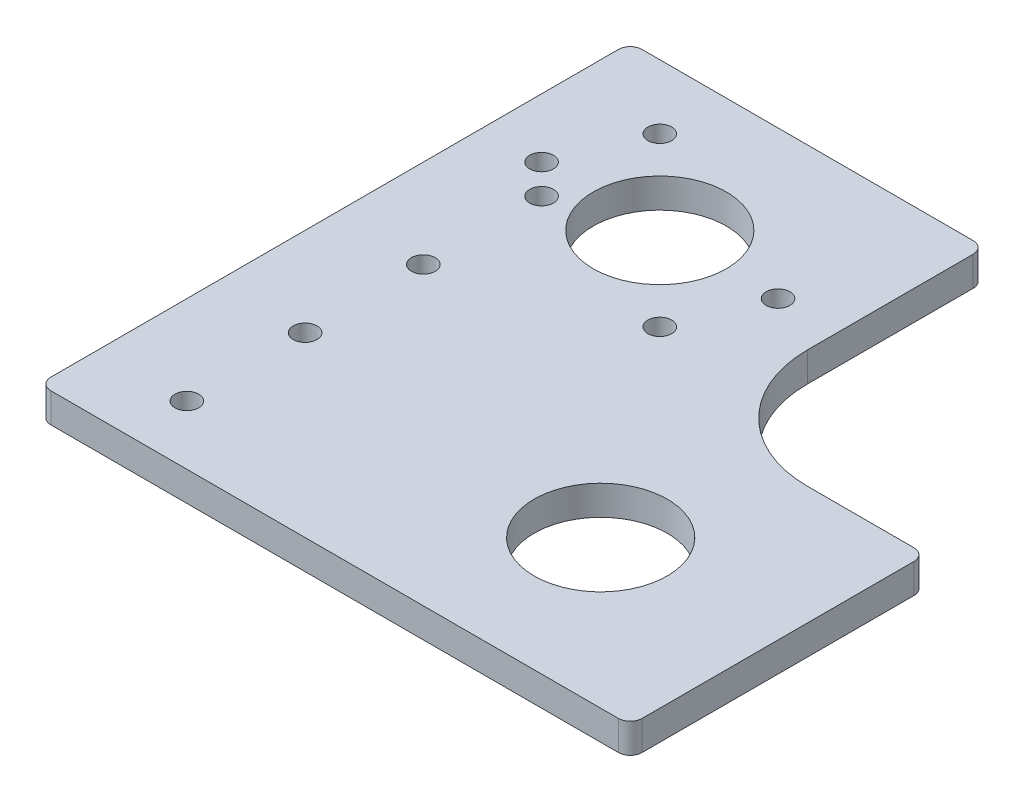
ISO-10303-21;
HEADER;
FILE_DESCRIPTION(('STEP AP214'),'2;1');
FILE_NAME('part.step','',(''),(''),'','','');
FILE_SCHEMA(('AUTOMOTIVE_DESIGN { 1 0 10303 214 1 1 1 1 }'));
ENDSEC;
DATA;
#1=APPLICATION_CONTEXT('core data for automotive mechanical design processes');
#2=APPLICATION_PROTOCOL_DEFINITION('international standard','automotive_design',2000,#1);
#3=PRODUCT_CONTEXT('',#1,'mechanical');
#4=PRODUCT('Part','Part','',(#3));
#5=PRODUCT_RELATED_PRODUCT_CATEGORY('part','',(#4));
#6=PRODUCT_DEFINITION_FORMATION('','',#4);
#7=PRODUCT_DEFINITION_CONTEXT('part definition',#1,'design');
#8=PRODUCT_DEFINITION('design','',#6,#7);
#9=PRODUCT_DEFINITION_SHAPE('','',#8);
#10=(LENGTH_UNIT() NAMED_UNIT(*) SI_UNIT(.MILLI.,.METRE.));
#11=(NAMED_UNIT(*) PLANE_ANGLE_UNIT() SI_UNIT($,.RADIAN.));
#12=(NAMED_UNIT(*) SI_UNIT($,.STERADIAN.) SOLID_ANGLE_UNIT());
#13=UNCERTAINTY_MEASURE_WITH_UNIT(LENGTH_MEASURE(1.E-05),#10,'distance_accuracy_value','');
#14=(GEOMETRIC_REPRESENTATION_CONTEXT(3) GLOBAL_UNCERTAINTY_ASSIGNED_CONTEXT((#13)) GLOBAL_UNIT_ASSIGNED_CONTEXT((#10,
#11,#12)) REPRESENTATION_CONTEXT('',''));
#15=CARTESIAN_POINT('',(0.,0.,0.));
#16=DIRECTION('',(0.,0.,1.));
#17=DIRECTION('',(1.,0.,0.));
#18=AXIS2_PLACEMENT_3D('',#15,#16,#17);
#19=CARTESIAN_POINT('',(-107.95,0.,-88.9));
#20=DIRECTION('',(0.,1.,0.));
#21=DIRECTION('',(0.,0.,1.));
#22=AXIS2_PLACEMENT_3D('',#19,#20,#21);
#23=CYLINDRICAL_SURFACE('',#22,2.55270000000001);
#24=CARTESIAN_POINT('',(-107.95,0.,-88.9));
#25=DIRECTION('',(0.,1.,0.));
#26=DIRECTION('',(0.,0.,1.));
#27=AXIS2_PLACEMENT_3D('',#24,#25,#26);
#28=CIRCLE('',#27,2.55270000000001);
#29=CARTESIAN_POINT('',(-107.95,0.,-86.3473));
#30=VERTEX_POINT('',#29);
#31=EDGE_CURVE('E44',#30,#30,#28,.T.);
#32=ORIENTED_EDGE('',*,*,#31,.F.);
#33=EDGE_LOOP('',(#32));
#34=FACE_BOUND('',#33,.T.);
#35=CARTESIAN_POINT('',(-107.95,6.35,-88.9));
#36=DIRECTION('',(0.,1.,0.));
#37=DIRECTION('',(0.,0.,1.));
#38=AXIS2_PLACEMENT_3D('',#35,#36,#37);
#39=CIRCLE('',#38,2.55270000000001);
#40=CARTESIAN_POINT('',(-107.95,6.35,-86.3473));
#41=VERTEX_POINT('',#40);
#42=EDGE_CURVE('E11',#41,#41,#39,.T.);
#43=ORIENTED_EDGE('',*,*,#42,.T.);
#44=EDGE_LOOP('',(#43));
#45=FACE_BOUND('',#44,.T.);
#46=ADVANCED_FACE('F37',(#34,#45),#23,.F.);
#47=CARTESIAN_POINT('',(-107.95,0.,-63.5));
#48=DIRECTION('',(0.,1.,0.));
#49=DIRECTION('',(0.,0.,1.));
#50=AXIS2_PLACEMENT_3D('',#47,#48,#49);
#51=CYLINDRICAL_SURFACE('',#50,2.55270000000001);
#52=CARTESIAN_POINT('',(-107.95,0.,-63.5));
#53=DIRECTION('',(0.,1.,0.));
#54=DIRECTION('',(0.,0.,1.));
#55=AXIS2_PLACEMENT_3D('',#52,#53,#54);
#56=CIRCLE('',#55,2.55270000000001);
#57=CARTESIAN_POINT('',(-107.95,0.,-60.9473));
#58=VERTEX_POINT('',#57);
#59=EDGE_CURVE('E208',#58,#58,#56,.T.);
#60=ORIENTED_EDGE('',*,*,#59,.F.);
#61=EDGE_LOOP('',(#60));
#62=FACE_BOUND('',#61,.T.);
#63=CARTESIAN_POINT('',(-107.95,6.35,-63.5));
#64=DIRECTION('',(0.,1.,0.));
#65=DIRECTION('',(0.,0.,1.));
#66=AXIS2_PLACEMENT_3D('',#63,#64,#65);
#67=CIRCLE('',#66,2.55270000000001);
#68=CARTESIAN_POINT('',(-107.95,6.35,-60.9473));
#69=VERTEX_POINT('',#68);
#70=EDGE_CURVE('E211',#69,#69,#67,.T.);
#71=ORIENTED_EDGE('',*,*,#70,.T.);
#72=EDGE_LOOP('',(#71));
#73=FACE_BOUND('',#72,.T.);
#74=ADVANCED_FACE('F219',(#62,#73),#51,.F.);
#75=CARTESIAN_POINT('',(0.,6.35,0.));
#76=DIRECTION('',(-1.,0.,0.));
#77=DIRECTION('',(0.,0.,1.));
#78=AXIS2_PLACEMENT_3D('',#75,#76,#77);
#79=PLANE('',#78);
#80=DIRECTION('',(0.,0.,-1.));
#81=VECTOR('',#80,1.);
#82=CARTESIAN_POINT('',(0.,6.35,0.));
#83=LINE('',#82,#81);
#84=CARTESIAN_POINT('',(0.,6.35,-2.54));
#85=VERTEX_POINT('',#84);
#86=CARTESIAN_POINT('',(0.,6.35,-60.96));
#87=VERTEX_POINT('',#86);
#88=EDGE_CURVE('E154',#85,#87,#83,.T.);
#89=ORIENTED_EDGE('',*,*,#88,.F.);
#90=DIRECTION('',(0.,-1.,0.));
#91=VECTOR('',#90,1.);
#92=CARTESIAN_POINT('',(0.,6.35,-2.54));
#93=LINE('',#92,#91);
#94=CARTESIAN_POINT('',(0.,0.,-2.54));
#95=VERTEX_POINT('',#94);
#96=EDGE_CURVE('E188',#85,#95,#93,.T.);
#97=ORIENTED_EDGE('',*,*,#96,.T.);
#98=DIRECTION('',(0.,0.,-1.));
#99=VECTOR('',#98,1.);
#100=CARTESIAN_POINT('',(0.,0.,0.));
#101=LINE('',#100,#99);
#102=CARTESIAN_POINT('',(0.,0.,-60.96));
#103=VERTEX_POINT('',#102);
#104=EDGE_CURVE('E545',#95,#103,#101,.T.);
#105=ORIENTED_EDGE('',*,*,#104,.T.);
#106=DIRECTION('',(0.,1.,0.));
#107=VECTOR('',#106,1.);
#108=CARTESIAN_POINT('',(0.,6.35,-60.96));
#109=LINE('',#108,#107);
#110=EDGE_CURVE('E185',#103,#87,#109,.T.);
#111=ORIENTED_EDGE('',*,*,#110,.T.);
#112=EDGE_LOOP('',(#89,#97,#105,#111));
#113=FACE_BOUND('',#112,.T.);
#114=ADVANCED_FACE('F247',(#113),#79,.F.);
#115=CARTESIAN_POINT('',(0.,6.35,-127.));
#116=DIRECTION('',(0.,0.,1.));
#117=DIRECTION('',(1.,0.,0.));
#118=AXIS2_PLACEMENT_3D('',#115,#116,#117);
#119=PLANE('',#118);
#120=DIRECTION('',(-1.,0.,0.));
#121=VECTOR('',#120,1.);
#122=CARTESIAN_POINT('',(0.,6.35,-127.));
#123=LINE('',#122,#121);
#124=CARTESIAN_POINT('',(-53.34,6.35,-127.));
#125=VERTEX_POINT('',#124);
#126=CARTESIAN_POINT('',(-124.46,6.35,-127.));
#127=VERTEX_POINT('',#126);
#128=EDGE_CURVE('E158',#125,#127,#123,.T.);
#129=ORIENTED_EDGE('',*,*,#128,.F.);
#130=DIRECTION('',(0.,1.,0.));
#131=VECTOR('',#130,1.);
#132=CARTESIAN_POINT('',(-53.34,6.35,-127.));
#133=LINE('',#132,#131);
#134=CARTESIAN_POINT('',(-53.34,0.,-127.));
#135=VERTEX_POINT('',#134);
#136=EDGE_CURVE('E199',#125,#135,#133,.F.);
#137=ORIENTED_EDGE('',*,*,#136,.T.);
#138=DIRECTION('',(-1.,0.,0.));
#139=VECTOR('',#138,1.);
#140=CARTESIAN_POINT('',(0.,0.,-127.));
#141=LINE('',#140,#139);
#142=CARTESIAN_POINT('',(-124.46,0.,-127.));
#143=VERTEX_POINT('',#142);
#144=EDGE_CURVE('E160',#135,#143,#141,.T.);
#145=ORIENTED_EDGE('',*,*,#144,.T.);
#146=DIRECTION('',(0.,-1.,0.));
#147=VECTOR('',#146,1.);
#148=CARTESIAN_POINT('',(-124.46,6.35,-127.));
#149=LINE('',#148,#147);
#150=EDGE_CURVE('E197',#143,#127,#149,.F.);
#151=ORIENTED_EDGE('',*,*,#150,.T.);
#152=EDGE_LOOP('',(#129,#137,#145,#151));
#153=FACE_BOUND('',#152,.T.);
#154=ADVANCED_FACE('F243',(#153),#119,.F.);
#155=CARTESIAN_POINT('',(-127.,6.35,0.));
#156=DIRECTION('',(1.,0.,0.));
#157=DIRECTION('',(0.,0.,-1.));
#158=AXIS2_PLACEMENT_3D('',#155,#156,#157);
#159=PLANE('',#158);
#160=DIRECTION('',(0.,0.,1.));
#161=VECTOR('',#160,1.);
#162=CARTESIAN_POINT('',(-127.,0.,0.));
#163=LINE('',#162,#161);
#164=CARTESIAN_POINT('',(-127.,0.,-124.46));
#165=VERTEX_POINT('',#164);
#166=CARTESIAN_POINT('',(-127.,0.,-2.54));
#167=VERTEX_POINT('',#166);
#168=EDGE_CURVE('E155',#165,#167,#163,.T.);
#169=ORIENTED_EDGE('',*,*,#168,.T.);
#170=DIRECTION('',(0.,-1.,0.));
#171=VECTOR('',#170,1.);
#172=CARTESIAN_POINT('',(-127.,6.35,-2.54));
#173=LINE('',#172,#171);
#174=CARTESIAN_POINT('',(-127.,6.35,-2.54));
#175=VERTEX_POINT('',#174);
#176=EDGE_CURVE('E132',#167,#175,#173,.F.);
#177=ORIENTED_EDGE('',*,*,#176,.T.);
#178=DIRECTION('',(0.,0.,1.));
#179=VECTOR('',#178,1.);
#180=CARTESIAN_POINT('',(-127.,6.35,0.));
#181=LINE('',#180,#179);
#182=CARTESIAN_POINT('',(-127.,6.35,-124.46));
#183=VERTEX_POINT('',#182);
#184=EDGE_CURVE('E550',#183,#175,#181,.T.);
#185=ORIENTED_EDGE('',*,*,#184,.F.);
#186=DIRECTION('',(0.,-1.,0.));
#187=VECTOR('',#186,1.);
#188=CARTESIAN_POINT('',(-127.,6.35,-124.46));
#189=LINE('',#188,#187);
#190=EDGE_CURVE('E137',#183,#165,#189,.T.);
#191=ORIENTED_EDGE('',*,*,#190,.T.);
#192=EDGE_LOOP('',(#169,#177,#185,#191));
#193=FACE_BOUND('',#192,.T.);
#194=ADVANCED_FACE('F233',(#193),#159,.F.);
#195=CARTESIAN_POINT('',(0.,6.35,0.));
#196=DIRECTION('',(0.,0.,-1.));
#197=DIRECTION('',(-1.,0.,0.));
#198=AXIS2_PLACEMENT_3D('',#195,#196,#197);
#199=PLANE('',#198);
#200=DIRECTION('',(1.,0.,0.));
#201=VECTOR('',#200,1.);
#202=CARTESIAN_POINT('',(0.,6.35,0.));
#203=LINE('',#202,#201);
#204=CARTESIAN_POINT('',(-124.46,6.35,0.));
#205=VERTEX_POINT('',#204);
#206=CARTESIAN_POINT('',(-2.54,6.35,0.));
#207=VERTEX_POINT('',#206);
#208=EDGE_CURVE('E147',#205,#207,#203,.T.);
#209=ORIENTED_EDGE('',*,*,#208,.F.);
#210=DIRECTION('',(0.,-1.,0.));
#211=VECTOR('',#210,1.);
#212=CARTESIAN_POINT('',(-124.46,6.35,0.));
#213=LINE('',#212,#211);
#214=CARTESIAN_POINT('',(-124.46,0.,0.));
#215=VERTEX_POINT('',#214);
#216=EDGE_CURVE('E131',#205,#215,#213,.T.);
#217=ORIENTED_EDGE('',*,*,#216,.T.);
#218=DIRECTION('',(1.,0.,0.));
#219=VECTOR('',#218,1.);
#220=CARTESIAN_POINT('',(0.,0.,0.));
#221=LINE('',#220,#219);
#222=CARTESIAN_POINT('',(-2.54,0.,0.));
#223=VERTEX_POINT('',#222);
#224=EDGE_CURVE('E144',#215,#223,#221,.T.);
#225=ORIENTED_EDGE('',*,*,#224,.T.);
#226=DIRECTION('',(0.,-1.,0.));
#227=VECTOR('',#226,1.);
#228=CARTESIAN_POINT('',(-2.54,6.35,0.));
#229=LINE('',#228,#227);
#230=EDGE_CURVE('E149',#223,#207,#229,.F.);
#231=ORIENTED_EDGE('',*,*,#230,.T.);
#232=EDGE_LOOP('',(#209,#217,#225,#231));
#233=FACE_BOUND('',#232,.T.);
#234=ADVANCED_FACE('F143',(#233),#199,.F.);
#235=CARTESIAN_POINT('',(0.,6.35,0.));
#236=DIRECTION('',(0.,1.,0.));
#237=DIRECTION('',(0.,0.,1.));
#238=AXIS2_PLACEMENT_3D('',#235,#236,#237);
#239=PLANE('',#238);
#240=CARTESIAN_POINT('',(-107.95,6.35,-38.1));
#241=DIRECTION('',(0.,1.,0.));
#242=DIRECTION('',(0.,0.,1.));
#243=AXIS2_PLACEMENT_3D('',#240,#241,#242);
#244=CIRCLE('',#243,2.55270000000001);
#245=CARTESIAN_POINT('',(-107.95,6.35,-35.5473));
#246=VERTEX_POINT('',#245);
#247=EDGE_CURVE('E600',#246,#246,#244,.T.);
#248=ORIENTED_EDGE('',*,*,#247,.F.);
#249=EDGE_LOOP('',(#248));
#250=FACE_BOUND('',#249,.T.);
#251=CARTESIAN_POINT('',(-107.95,6.35,-12.7));
#252=DIRECTION('',(0.,1.,0.));
#253=DIRECTION('',(0.,0.,1.));
#254=AXIS2_PLACEMENT_3D('',#251,#252,#253);
#255=CIRCLE('',#254,2.55270000000001);
#256=CARTESIAN_POINT('',(-107.95,6.35,-10.1473));
#257=VERTEX_POINT('',#256);
#258=EDGE_CURVE('E506',#257,#257,#255,.T.);
#259=ORIENTED_EDGE('',*,*,#258,.F.);
#260=EDGE_LOOP('',(#259));
#261=FACE_BOUND('',#260,.T.);
#262=CARTESIAN_POINT('',(-88.9,6.35,-95.25));
#263=DIRECTION('',(0.,1.,0.));
#264=DIRECTION('',(0.,0.,1.));
#265=AXIS2_PLACEMENT_3D('',#262,#263,#264);
#266=CIRCLE('',#265,14.3002);
#267=CARTESIAN_POINT('',(-88.9,6.35,-80.9498));
#268=VERTEX_POINT('',#267);
#269=EDGE_CURVE('E499',#268,#268,#266,.T.);
#270=ORIENTED_EDGE('',*,*,#269,.F.);
#271=EDGE_LOOP('',(#270));
#272=FACE_BOUND('',#271,.T.);
#273=CARTESIAN_POINT('',(-70.9394877578616,6.35,-77.2894877578618));
#274=DIRECTION('',(0.,1.,0.));
#275=DIRECTION('',(0.707106781186543,0.,-0.707106781186552));
#276=AXIS2_PLACEMENT_3D('',#273,#274,#275);
#277=CIRCLE('',#276,2.55270000000003);
#278=CARTESIAN_POINT('',(-69.1344562775267,6.35,-79.0945192381967));
#279=VERTEX_POINT('',#278);
#280=EDGE_CURVE('E514',#279,#279,#277,.T.);
#281=ORIENTED_EDGE('',*,*,#280,.F.);
#282=EDGE_LOOP('',(#281));
#283=FACE_BOUND('',#282,.T.);
#284=CARTESIAN_POINT('',(-63.5,6.35,-95.25));
#285=DIRECTION('',(0.,1.,0.));
#286=DIRECTION('',(0.,0.,-1.));
#287=AXIS2_PLACEMENT_3D('',#284,#285,#286);
#288=CIRCLE('',#287,2.55270000000003);
#289=CARTESIAN_POINT('',(-63.5,6.35,-97.8027));
#290=VERTEX_POINT('',#289);
#291=EDGE_CURVE('E520',#290,#290,#288,.T.);
#292=ORIENTED_EDGE('',*,*,#291,.F.);
#293=EDGE_LOOP('',(#292));
#294=FACE_BOUND('',#293,.T.);
#295=CARTESIAN_POINT('',(-106.860512242139,6.35,-113.210512242138));
#296=DIRECTION('',(0.,1.,0.));
#297=DIRECTION('',(-0.707106781186538,0.,0.707106781186557));
#298=AXIS2_PLACEMENT_3D('',#295,#296,#297);
#299=CIRCLE('',#298,2.55270000000003);
#300=CARTESIAN_POINT('',(-108.665543722473,6.35,-111.405480761803));
#301=VERTEX_POINT('',#300);
#302=EDGE_CURVE('E503',#301,#301,#299,.T.);
#303=ORIENTED_EDGE('',*,*,#302,.F.);
#304=EDGE_LOOP('',(#303));
#305=FACE_BOUND('',#304,.T.);
#306=CARTESIAN_POINT('',(-114.3,6.35,-95.25));
#307=DIRECTION('',(0.,1.,0.));
#308=DIRECTION('',(0.,0.,1.));
#309=AXIS2_PLACEMENT_3D('',#306,#307,#308);
#310=CIRCLE('',#309,2.55270000000003);
#311=CARTESIAN_POINT('',(-114.3,6.35,-92.6973));
#312=VERTEX_POINT('',#311);
#313=EDGE_CURVE('E513',#312,#312,#310,.T.);
#314=ORIENTED_EDGE('',*,*,#313,.F.);
#315=EDGE_LOOP('',(#314));
#316=FACE_BOUND('',#315,.T.);
#317=CARTESIAN_POINT('',(-38.1,6.35,-31.75));
#318=DIRECTION('',(0.,1.,0.));
#319=DIRECTION('',(0.,0.,1.));
#320=AXIS2_PLACEMENT_3D('',#317,#318,#319);
#321=CIRCLE('',#320,14.3002);
#322=CARTESIAN_POINT('',(-38.1,6.35,-17.4498));
#323=VERTEX_POINT('',#322);
#324=EDGE_CURVE('E531',#323,#323,#321,.T.);
#325=ORIENTED_EDGE('',*,*,#324,.F.);
#326=EDGE_LOOP('',(#325));
#327=FACE_BOUND('',#326,.T.);
#328=ORIENTED_EDGE('',*,*,#184,.T.);
#329=CARTESIAN_POINT('',(-124.46,6.35,-2.54));
#330=DIRECTION('',(0.,1.,0.));
#331=DIRECTION('',(0.,0.,1.));
#332=AXIS2_PLACEMENT_3D('',#329,#330,#331);
#333=CIRCLE('',#332,2.54);
#334=EDGE_CURVE('E183',#175,#205,#333,.T.);
#335=ORIENTED_EDGE('',*,*,#334,.T.);
#336=ORIENTED_EDGE('',*,*,#208,.T.);
#337=CARTESIAN_POINT('',(-2.54,6.35,-2.54));
#338=DIRECTION('',(0.,1.,0.));
#339=DIRECTION('',(0.,0.,1.));
#340=AXIS2_PLACEMENT_3D('',#337,#338,#339);
#341=CIRCLE('',#340,2.54);
#342=EDGE_CURVE('E181',#207,#85,#341,.T.);
#343=ORIENTED_EDGE('',*,*,#342,.T.);
#344=ORIENTED_EDGE('',*,*,#88,.T.);
#345=CARTESIAN_POINT('',(-2.54,6.35,-60.96));
#346=DIRECTION('',(0.,1.,0.));
#347=DIRECTION('',(0.,0.,1.));
#348=AXIS2_PLACEMENT_3D('',#345,#346,#347);
#349=CIRCLE('',#348,2.54);
#350=CARTESIAN_POINT('',(-2.54,6.35,-63.5));
#351=VERTEX_POINT('',#350);
#352=EDGE_CURVE('E178',#87,#351,#349,.T.);
#353=ORIENTED_EDGE('',*,*,#352,.T.);
#354=DIRECTION('',(1.,0.,0.));
#355=VECTOR('',#354,1.);
#356=CARTESIAN_POINT('',(0.,6.35,-63.5));
#357=LINE('',#356,#355);
#358=CARTESIAN_POINT('',(-25.4,6.35,-63.5));
#359=VERTEX_POINT('',#358);
#360=EDGE_CURVE('E543',#359,#351,#357,.T.);
#361=ORIENTED_EDGE('',*,*,#360,.F.);
#362=CARTESIAN_POINT('',(-25.4,6.35,-88.9));
#363=DIRECTION('',(0.,1.,0.));
#364=DIRECTION('',(0.,0.,1.));
#365=AXIS2_PLACEMENT_3D('',#362,#363,#364);
#366=CIRCLE('',#365,25.4);
#367=CARTESIAN_POINT('',(-50.8,6.35,-88.9));
#368=VERTEX_POINT('',#367);
#369=EDGE_CURVE('E51',#359,#368,#366,.F.);
#370=ORIENTED_EDGE('',*,*,#369,.T.);
#371=DIRECTION('',(0.,0.,1.));
#372=VECTOR('',#371,1.);
#373=CARTESIAN_POINT('',(-50.8,6.35,-127.));
#374=LINE('',#373,#372);
#375=CARTESIAN_POINT('',(-50.8,6.35,-124.46));
#376=VERTEX_POINT('',#375);
#377=EDGE_CURVE('E537',#376,#368,#374,.T.);
#378=ORIENTED_EDGE('',*,*,#377,.F.);
#379=CARTESIAN_POINT('',(-53.34,6.35,-124.46));
#380=DIRECTION('',(0.,1.,0.));
#381=DIRECTION('',(0.,0.,1.));
#382=AXIS2_PLACEMENT_3D('',#379,#380,#381);
#383=CIRCLE('',#382,2.54);
#384=EDGE_CURVE('E176',#376,#125,#383,.T.);
#385=ORIENTED_EDGE('',*,*,#384,.T.);
#386=ORIENTED_EDGE('',*,*,#128,.T.);
#387=CARTESIAN_POINT('',(-124.46,6.35,-124.46));
#388=DIRECTION('',(0.,1.,0.));
#389=DIRECTION('',(0.,0.,1.));
#390=AXIS2_PLACEMENT_3D('',#387,#388,#389);
#391=CIRCLE('',#390,2.54);
#392=EDGE_CURVE('E174',#127,#183,#391,.T.);
#393=ORIENTED_EDGE('',*,*,#392,.T.);
#394=EDGE_LOOP('',(#328,#335,#336,#343,#344,#353,#361,#370,#378,#385,#386,#393));
#395=FACE_BOUND('',#394,.T.);
#396=ORIENTED_EDGE('',*,*,#70,.F.);
#397=EDGE_LOOP('',(#396));
#398=FACE_BOUND('',#397,.T.);
#399=ORIENTED_EDGE('',*,*,#42,.F.);
#400=EDGE_LOOP('',(#399));
#401=FACE_BOUND('',#400,.T.);
#402=ADVANCED_FACE('F222',(#250,#261,#272,#283,#294,#305,#316,#327,#395,#398,#401),#239,.T.);
#403=CARTESIAN_POINT('',(0.,0.,0.));
#404=DIRECTION('',(0.,1.,0.));
#405=DIRECTION('',(0.,0.,1.));
#406=AXIS2_PLACEMENT_3D('',#403,#404,#405);
#407=PLANE('',#406);
#408=CARTESIAN_POINT('',(-107.95,0.,-38.1));
#409=DIRECTION('',(0.,1.,0.));
#410=DIRECTION('',(0.,0.,1.));
#411=AXIS2_PLACEMENT_3D('',#408,#409,#410);
#412=CIRCLE('',#411,2.55270000000001);
#413=CARTESIAN_POINT('',(-107.95,0.,-35.5473));
#414=VERTEX_POINT('',#413);
#415=EDGE_CURVE('E604',#414,#414,#412,.T.);
#416=ORIENTED_EDGE('',*,*,#415,.T.);
#417=EDGE_LOOP('',(#416));
#418=FACE_BOUND('',#417,.T.);
#419=CARTESIAN_POINT('',(-107.95,0.,-12.7));
#420=DIRECTION('',(0.,1.,0.));
#421=DIRECTION('',(0.,0.,1.));
#422=AXIS2_PLACEMENT_3D('',#419,#420,#421);
#423=CIRCLE('',#422,2.55270000000001);
#424=CARTESIAN_POINT('',(-107.95,0.,-10.1473));
#425=VERTEX_POINT('',#424);
#426=EDGE_CURVE('E501',#425,#425,#423,.T.);
#427=ORIENTED_EDGE('',*,*,#426,.T.);
#428=EDGE_LOOP('',(#427));
#429=FACE_BOUND('',#428,.T.);
#430=CARTESIAN_POINT('',(-88.9,0.,-95.25));
#431=DIRECTION('',(0.,1.,0.));
#432=DIRECTION('',(0.,0.,1.));
#433=AXIS2_PLACEMENT_3D('',#430,#431,#432);
#434=CIRCLE('',#433,14.3002);
#435=CARTESIAN_POINT('',(-88.9,0.,-80.9498));
#436=VERTEX_POINT('',#435);
#437=EDGE_CURVE('E496',#436,#436,#434,.T.);
#438=ORIENTED_EDGE('',*,*,#437,.T.);
#439=EDGE_LOOP('',(#438));
#440=FACE_BOUND('',#439,.T.);
#441=CARTESIAN_POINT('',(-70.9394877578616,0.,-77.2894877578618));
#442=DIRECTION('',(0.,1.,0.));
#443=DIRECTION('',(0.707106781186543,0.,-0.707106781186552));
#444=AXIS2_PLACEMENT_3D('',#441,#442,#443);
#445=CIRCLE('',#444,2.55270000000003);
#446=CARTESIAN_POINT('',(-69.1344562775267,0.,-79.0945192381967));
#447=VERTEX_POINT('',#446);
#448=EDGE_CURVE('E510',#447,#447,#445,.T.);
#449=ORIENTED_EDGE('',*,*,#448,.T.);
#450=EDGE_LOOP('',(#449));
#451=FACE_BOUND('',#450,.T.);
#452=CARTESIAN_POINT('',(-63.5,0.,-95.25));
#453=DIRECTION('',(0.,1.,0.));
#454=DIRECTION('',(0.,0.,-1.));
#455=AXIS2_PLACEMENT_3D('',#452,#453,#454);
#456=CIRCLE('',#455,2.55270000000003);
#457=CARTESIAN_POINT('',(-63.5,0.,-97.8027));
#458=VERTEX_POINT('',#457);
#459=EDGE_CURVE('E517',#458,#458,#456,.T.);
#460=ORIENTED_EDGE('',*,*,#459,.T.);
#461=EDGE_LOOP('',(#460));
#462=FACE_BOUND('',#461,.T.);
#463=CARTESIAN_POINT('',(-106.860512242139,0.,-113.210512242138));
#464=DIRECTION('',(0.,1.,0.));
#465=DIRECTION('',(-0.707106781186538,0.,0.707106781186557));
#466=AXIS2_PLACEMENT_3D('',#463,#464,#465);
#467=CIRCLE('',#466,2.55270000000003);
#468=CARTESIAN_POINT('',(-108.665543722473,0.,-111.405480761803));
#469=VERTEX_POINT('',#468);
#470=EDGE_CURVE('E523',#469,#469,#467,.T.);
#471=ORIENTED_EDGE('',*,*,#470,.T.);
#472=EDGE_LOOP('',(#471));
#473=FACE_BOUND('',#472,.T.);
#474=CARTESIAN_POINT('',(-114.3,0.,-95.25));
#475=DIRECTION('',(0.,1.,0.));
#476=DIRECTION('',(0.,0.,1.));
#477=AXIS2_PLACEMENT_3D('',#474,#475,#476);
#478=CIRCLE('',#477,2.55270000000003);
#479=CARTESIAN_POINT('',(-114.3,0.,-92.6973));
#480=VERTEX_POINT('',#479);
#481=EDGE_CURVE('E528',#480,#480,#478,.T.);
#482=ORIENTED_EDGE('',*,*,#481,.T.);
#483=EDGE_LOOP('',(#482));
#484=FACE_BOUND('',#483,.T.);
#485=CARTESIAN_POINT('',(-38.1,0.,-31.75));
#486=DIRECTION('',(0.,1.,0.));
#487=DIRECTION('',(0.,0.,1.));
#488=AXIS2_PLACEMENT_3D('',#485,#486,#487);
#489=CIRCLE('',#488,14.3002);
#490=CARTESIAN_POINT('',(-38.1,0.,-17.4498));
#491=VERTEX_POINT('',#490);
#492=EDGE_CURVE('E534',#491,#491,#489,.T.);
#493=ORIENTED_EDGE('',*,*,#492,.T.);
#494=EDGE_LOOP('',(#493));
#495=FACE_BOUND('',#494,.T.);
#496=ORIENTED_EDGE('',*,*,#224,.F.);
#497=CARTESIAN_POINT('',(-124.46,0.,-2.54));
#498=DIRECTION('',(0.,1.,0.));
#499=DIRECTION('',(0.,0.,1.));
#500=AXIS2_PLACEMENT_3D('',#497,#498,#499);
#501=CIRCLE('',#500,2.54);
#502=EDGE_CURVE('E127',#215,#167,#501,.F.);
#503=ORIENTED_EDGE('',*,*,#502,.T.);
#504=ORIENTED_EDGE('',*,*,#168,.F.);
#505=CARTESIAN_POINT('',(-124.46,0.,-124.46));
#506=DIRECTION('',(0.,1.,0.));
#507=DIRECTION('',(0.,0.,1.));
#508=AXIS2_PLACEMENT_3D('',#505,#506,#507);
#509=CIRCLE('',#508,2.54);
#510=EDGE_CURVE('E148',#165,#143,#509,.F.);
#511=ORIENTED_EDGE('',*,*,#510,.T.);
#512=ORIENTED_EDGE('',*,*,#144,.F.);
#513=CARTESIAN_POINT('',(-53.34,0.,-124.46));
#514=DIRECTION('',(0.,1.,0.));
#515=DIRECTION('',(0.,0.,1.));
#516=AXIS2_PLACEMENT_3D('',#513,#514,#515);
#517=CIRCLE('',#516,2.54);
#518=CARTESIAN_POINT('',(-50.8,0.,-124.46));
#519=VERTEX_POINT('',#518);
#520=EDGE_CURVE('E166',#135,#519,#517,.F.);
#521=ORIENTED_EDGE('',*,*,#520,.T.);
#522=DIRECTION('',(0.,0.,1.));
#523=VECTOR('',#522,1.);
#524=CARTESIAN_POINT('',(-50.8,0.,-127.));
#525=LINE('',#524,#523);
#526=CARTESIAN_POINT('',(-50.8,0.,-88.9));
#527=VERTEX_POINT('',#526);
#528=EDGE_CURVE('E540',#519,#527,#525,.T.);
#529=ORIENTED_EDGE('',*,*,#528,.T.);
#530=CARTESIAN_POINT('',(-25.4,0.,-88.9));
#531=DIRECTION('',(0.,1.,0.));
#532=DIRECTION('',(0.,0.,1.));
#533=AXIS2_PLACEMENT_3D('',#530,#531,#532);
#534=CIRCLE('',#533,25.4);
#535=CARTESIAN_POINT('',(-25.4,0.,-63.5));
#536=VERTEX_POINT('',#535);
#537=EDGE_CURVE('E206',#527,#536,#534,.T.);
#538=ORIENTED_EDGE('',*,*,#537,.T.);
#539=DIRECTION('',(1.,0.,0.));
#540=VECTOR('',#539,1.);
#541=CARTESIAN_POINT('',(0.,0.,-63.5));
#542=LINE('',#541,#540);
#543=CARTESIAN_POINT('',(-2.54,0.,-63.5));
#544=VERTEX_POINT('',#543);
#545=EDGE_CURVE('E542',#536,#544,#542,.T.);
#546=ORIENTED_EDGE('',*,*,#545,.T.);
#547=CARTESIAN_POINT('',(-2.54,0.,-60.96));
#548=DIRECTION('',(0.,1.,0.));
#549=DIRECTION('',(0.,0.,1.));
#550=AXIS2_PLACEMENT_3D('',#547,#548,#549);
#551=CIRCLE('',#550,2.54);
#552=EDGE_CURVE('E168',#544,#103,#551,.F.);
#553=ORIENTED_EDGE('',*,*,#552,.T.);
#554=ORIENTED_EDGE('',*,*,#104,.F.);
#555=CARTESIAN_POINT('',(-2.54,0.,-2.54));
#556=DIRECTION('',(0.,1.,0.));
#557=DIRECTION('',(0.,0.,1.));
#558=AXIS2_PLACEMENT_3D('',#555,#556,#557);
#559=CIRCLE('',#558,2.54);
#560=EDGE_CURVE('E138',#95,#223,#559,.F.);
#561=ORIENTED_EDGE('',*,*,#560,.T.);
#562=EDGE_LOOP('',(#496,#503,#504,#511,#512,#521,#529,#538,#546,#553,#554,#561));
#563=FACE_BOUND('',#562,.T.);
#564=ORIENTED_EDGE('',*,*,#59,.T.);
#565=EDGE_LOOP('',(#564));
#566=FACE_BOUND('',#565,.T.);
#567=ORIENTED_EDGE('',*,*,#31,.T.);
#568=EDGE_LOOP('',(#567));
#569=FACE_BOUND('',#568,.T.);
#570=ADVANCED_FACE('F151',(#418,#429,#440,#451,#462,#473,#484,#495,#563,#566,#569),#407,.F.);
#571=CARTESIAN_POINT('',(0.,0.,-63.5));
#572=DIRECTION('',(0.,0.,1.));
#573=DIRECTION('',(1.,0.,0.));
#574=AXIS2_PLACEMENT_3D('',#571,#572,#573);
#575=PLANE('',#574);
#576=ORIENTED_EDGE('',*,*,#545,.F.);
#577=DIRECTION('',(0.,1.,0.));
#578=VECTOR('',#577,1.);
#579=CARTESIAN_POINT('',(-25.4,6.35,-63.5));
#580=LINE('',#579,#578);
#581=EDGE_CURVE('E201',#536,#359,#580,.T.);
#582=ORIENTED_EDGE('',*,*,#581,.T.);
#583=ORIENTED_EDGE('',*,*,#360,.T.);
#584=DIRECTION('',(0.,1.,0.));
#585=VECTOR('',#584,1.);
#586=CARTESIAN_POINT('',(-2.54,0.,-63.5));
#587=LINE('',#586,#585);
#588=EDGE_CURVE('E191',#351,#544,#587,.F.);
#589=ORIENTED_EDGE('',*,*,#588,.T.);
#590=EDGE_LOOP('',(#576,#582,#583,#589));
#591=FACE_BOUND('',#590,.T.);
#592=ADVANCED_FACE('F230',(#591),#575,.F.);
#593=CARTESIAN_POINT('',(-50.8,0.,-127.));
#594=DIRECTION('',(-1.,0.,0.));
#595=DIRECTION('',(0.,0.,1.));
#596=AXIS2_PLACEMENT_3D('',#593,#594,#595);
#597=PLANE('',#596);
#598=ORIENTED_EDGE('',*,*,#377,.T.);
#599=DIRECTION('',(0.,1.,0.));
#600=VECTOR('',#599,1.);
#601=CARTESIAN_POINT('',(-50.8,0.,-88.9));
#602=LINE('',#601,#600);
#603=EDGE_CURVE('E58',#368,#527,#602,.F.);
#604=ORIENTED_EDGE('',*,*,#603,.T.);
#605=ORIENTED_EDGE('',*,*,#528,.F.);
#606=DIRECTION('',(0.,1.,0.));
#607=VECTOR('',#606,1.);
#608=CARTESIAN_POINT('',(-50.8,0.,-124.46));
#609=LINE('',#608,#607);
#610=EDGE_CURVE('E194',#519,#376,#609,.T.);
#611=ORIENTED_EDGE('',*,*,#610,.T.);
#612=EDGE_LOOP('',(#598,#604,#605,#611));
#613=FACE_BOUND('',#612,.T.);
#614=ADVANCED_FACE('F238',(#613),#597,.F.);
#615=CARTESIAN_POINT('',(-38.1,0.,-31.75));
#616=DIRECTION('',(0.,1.,0.));
#617=DIRECTION('',(0.,0.,1.));
#618=AXIS2_PLACEMENT_3D('',#615,#616,#617);
#619=CYLINDRICAL_SURFACE('',#618,14.3002);
#620=ORIENTED_EDGE('',*,*,#492,.F.);
#621=EDGE_LOOP('',(#620));
#622=FACE_BOUND('',#621,.T.);
#623=ORIENTED_EDGE('',*,*,#324,.T.);
#624=EDGE_LOOP('',(#623));
#625=FACE_BOUND('',#624,.T.);
#626=ADVANCED_FACE('F361',(#622,#625),#619,.F.);
#627=CARTESIAN_POINT('',(-114.3,0.,-95.25));
#628=DIRECTION('',(0.,1.,0.));
#629=DIRECTION('',(0.,0.,1.));
#630=AXIS2_PLACEMENT_3D('',#627,#628,#629);
#631=CYLINDRICAL_SURFACE('',#630,2.55270000000003);
#632=ORIENTED_EDGE('',*,*,#481,.F.);
#633=EDGE_LOOP('',(#632));
#634=FACE_BOUND('',#633,.T.);
#635=ORIENTED_EDGE('',*,*,#313,.T.);
#636=EDGE_LOOP('',(#635));
#637=FACE_BOUND('',#636,.T.);
#638=ADVANCED_FACE('F424',(#634,#637),#631,.F.);
#639=CARTESIAN_POINT('',(-106.860512242139,0.,-113.210512242138));
#640=DIRECTION('',(0.,1.,0.));
#641=DIRECTION('',(0.,0.,1.));
#642=AXIS2_PLACEMENT_3D('',#639,#640,#641);
#643=CYLINDRICAL_SURFACE('',#642,2.55270000000003);
#644=ORIENTED_EDGE('',*,*,#470,.F.);
#645=EDGE_LOOP('',(#644));
#646=FACE_BOUND('',#645,.T.);
#647=ORIENTED_EDGE('',*,*,#302,.T.);
#648=EDGE_LOOP('',(#647));
#649=FACE_BOUND('',#648,.T.);
#650=ADVANCED_FACE('F434',(#646,#649),#643,.F.);
#651=CARTESIAN_POINT('',(-63.5,0.,-95.25));
#652=DIRECTION('',(0.,1.,0.));
#653=DIRECTION('',(0.,0.,1.));
#654=AXIS2_PLACEMENT_3D('',#651,#652,#653);
#655=CYLINDRICAL_SURFACE('',#654,2.55270000000003);
#656=ORIENTED_EDGE('',*,*,#459,.F.);
#657=EDGE_LOOP('',(#656));
#658=FACE_BOUND('',#657,.T.);
#659=ORIENTED_EDGE('',*,*,#291,.T.);
#660=EDGE_LOOP('',(#659));
#661=FACE_BOUND('',#660,.T.);
#662=ADVANCED_FACE('F444',(#658,#661),#655,.F.);
#663=CARTESIAN_POINT('',(-70.9394877578616,0.,-77.2894877578618));
#664=DIRECTION('',(0.,1.,0.));
#665=DIRECTION('',(0.,0.,1.));
#666=AXIS2_PLACEMENT_3D('',#663,#664,#665);
#667=CYLINDRICAL_SURFACE('',#666,2.55270000000003);
#668=ORIENTED_EDGE('',*,*,#448,.F.);
#669=EDGE_LOOP('',(#668));
#670=FACE_BOUND('',#669,.T.);
#671=ORIENTED_EDGE('',*,*,#280,.T.);
#672=EDGE_LOOP('',(#671));
#673=FACE_BOUND('',#672,.T.);
#674=ADVANCED_FACE('F454',(#670,#673),#667,.F.);
#675=CARTESIAN_POINT('',(-88.9,0.,-95.25));
#676=DIRECTION('',(0.,1.,0.));
#677=DIRECTION('',(0.,0.,1.));
#678=AXIS2_PLACEMENT_3D('',#675,#676,#677);
#679=CYLINDRICAL_SURFACE('',#678,14.3002);
#680=ORIENTED_EDGE('',*,*,#437,.F.);
#681=EDGE_LOOP('',(#680));
#682=FACE_BOUND('',#681,.T.);
#683=ORIENTED_EDGE('',*,*,#269,.T.);
#684=EDGE_LOOP('',(#683));
#685=FACE_BOUND('',#684,.T.);
#686=ADVANCED_FACE('F255',(#682,#685),#679,.F.);
#687=CARTESIAN_POINT('',(-124.46,6.35,-2.54));
#688=DIRECTION('',(0.,-1.,0.));
#689=DIRECTION('',(0.,0.,-1.));
#690=AXIS2_PLACEMENT_3D('',#687,#688,#689);
#691=CYLINDRICAL_SURFACE('',#690,2.54);
#692=ORIENTED_EDGE('',*,*,#334,.F.);
#693=ORIENTED_EDGE('',*,*,#176,.F.);
#694=ORIENTED_EDGE('',*,*,#502,.F.);
#695=ORIENTED_EDGE('',*,*,#216,.F.);
#696=EDGE_LOOP('',(#692,#693,#694,#695));
#697=FACE_BOUND('',#696,.T.);
#698=ADVANCED_FACE('F130',(#697),#691,.T.);
#699=CARTESIAN_POINT('',(-2.54,6.35,-2.54));
#700=DIRECTION('',(0.,-1.,0.));
#701=DIRECTION('',(0.,0.,-1.));
#702=AXIS2_PLACEMENT_3D('',#699,#700,#701);
#703=CYLINDRICAL_SURFACE('',#702,2.54);
#704=ORIENTED_EDGE('',*,*,#342,.F.);
#705=ORIENTED_EDGE('',*,*,#230,.F.);
#706=ORIENTED_EDGE('',*,*,#560,.F.);
#707=ORIENTED_EDGE('',*,*,#96,.F.);
#708=EDGE_LOOP('',(#704,#705,#706,#707));
#709=FACE_BOUND('',#708,.T.);
#710=ADVANCED_FACE('F254',(#709),#703,.T.);
#711=CARTESIAN_POINT('',(-2.54,6.35,-60.96));
#712=DIRECTION('',(0.,1.,0.));
#713=DIRECTION('',(0.,0.,1.));
#714=AXIS2_PLACEMENT_3D('',#711,#712,#713);
#715=CYLINDRICAL_SURFACE('',#714,2.54);
#716=ORIENTED_EDGE('',*,*,#552,.F.);
#717=ORIENTED_EDGE('',*,*,#588,.F.);
#718=ORIENTED_EDGE('',*,*,#352,.F.);
#719=ORIENTED_EDGE('',*,*,#110,.F.);
#720=EDGE_LOOP('',(#716,#717,#718,#719));
#721=FACE_BOUND('',#720,.T.);
#722=ADVANCED_FACE('F258',(#721),#715,.T.);
#723=CARTESIAN_POINT('',(-53.34,0.,-124.46));
#724=DIRECTION('',(0.,1.,0.));
#725=DIRECTION('',(0.,0.,1.));
#726=AXIS2_PLACEMENT_3D('',#723,#724,#725);
#727=CYLINDRICAL_SURFACE('',#726,2.54);
#728=ORIENTED_EDGE('',*,*,#520,.F.);
#729=ORIENTED_EDGE('',*,*,#136,.F.);
#730=ORIENTED_EDGE('',*,*,#384,.F.);
#731=ORIENTED_EDGE('',*,*,#610,.F.);
#732=EDGE_LOOP('',(#728,#729,#730,#731));
#733=FACE_BOUND('',#732,.T.);
#734=ADVANCED_FACE('F262',(#733),#727,.T.);
#735=CARTESIAN_POINT('',(-124.46,6.35,-124.46));
#736=DIRECTION('',(0.,-1.,0.));
#737=DIRECTION('',(0.,0.,-1.));
#738=AXIS2_PLACEMENT_3D('',#735,#736,#737);
#739=CYLINDRICAL_SURFACE('',#738,2.54);
#740=ORIENTED_EDGE('',*,*,#392,.F.);
#741=ORIENTED_EDGE('',*,*,#150,.F.);
#742=ORIENTED_EDGE('',*,*,#510,.F.);
#743=ORIENTED_EDGE('',*,*,#190,.F.);
#744=EDGE_LOOP('',(#740,#741,#742,#743));
#745=FACE_BOUND('',#744,.T.);
#746=ADVANCED_FACE('F266',(#745),#739,.T.);
#747=CARTESIAN_POINT('',(-25.4,0.,-88.9));
#748=DIRECTION('',(0.,-1.,0.));
#749=DIRECTION('',(0.,0.,-1.));
#750=AXIS2_PLACEMENT_3D('',#747,#748,#749);
#751=CYLINDRICAL_SURFACE('',#750,25.4);
#752=ORIENTED_EDGE('',*,*,#537,.F.);
#753=ORIENTED_EDGE('',*,*,#603,.F.);
#754=ORIENTED_EDGE('',*,*,#369,.F.);
#755=ORIENTED_EDGE('',*,*,#581,.F.);
#756=EDGE_LOOP('',(#752,#753,#754,#755));
#757=FACE_BOUND('',#756,.T.);
#758=ADVANCED_FACE('F270',(#757),#751,.F.);
#759=CARTESIAN_POINT('',(-107.95,0.,-12.7));
#760=DIRECTION('',(0.,1.,0.));
#761=DIRECTION('',(0.,0.,1.));
#762=AXIS2_PLACEMENT_3D('',#759,#760,#761);
#763=CYLINDRICAL_SURFACE('',#762,2.55270000000001);
#764=ORIENTED_EDGE('',*,*,#426,.F.);
#765=EDGE_LOOP('',(#764));
#766=FACE_BOUND('',#765,.T.);
#767=ORIENTED_EDGE('',*,*,#258,.T.);
#768=EDGE_LOOP('',(#767));
#769=FACE_BOUND('',#768,.T.);
#770=ADVANCED_FACE('F273',(#766,#769),#763,.F.);
#771=CARTESIAN_POINT('',(-107.95,0.,-38.1));
#772=DIRECTION('',(0.,1.,0.));
#773=DIRECTION('',(0.,0.,1.));
#774=AXIS2_PLACEMENT_3D('',#771,#772,#773);
#775=CYLINDRICAL_SURFACE('',#774,2.55270000000001);
#776=ORIENTED_EDGE('',*,*,#415,.F.);
#777=EDGE_LOOP('',(#776));
#778=FACE_BOUND('',#777,.T.);
#779=ORIENTED_EDGE('',*,*,#247,.T.);
#780=EDGE_LOOP('',(#779));
#781=FACE_BOUND('',#780,.T.);
#782=ADVANCED_FACE('F377',(#778,#781),#775,.F.);
#783=CLOSED_SHELL('',(#46,#74,#114,#154,#194,#234,#402,#570,#592,#614,#626,#638,#650,#662,#674,
#686,#698,#710,#722,#734,#746,#758,#770,#782));
#784=MANIFOLD_SOLID_BREP('B2',#783);
#785=ADVANCED_BREP_SHAPE_REPRESENTATION('',(#18,#784),#14);
#786=SHAPE_DEFINITION_REPRESENTATION(#9,#785);
ENDSEC;
END-ISO-10303-21;
